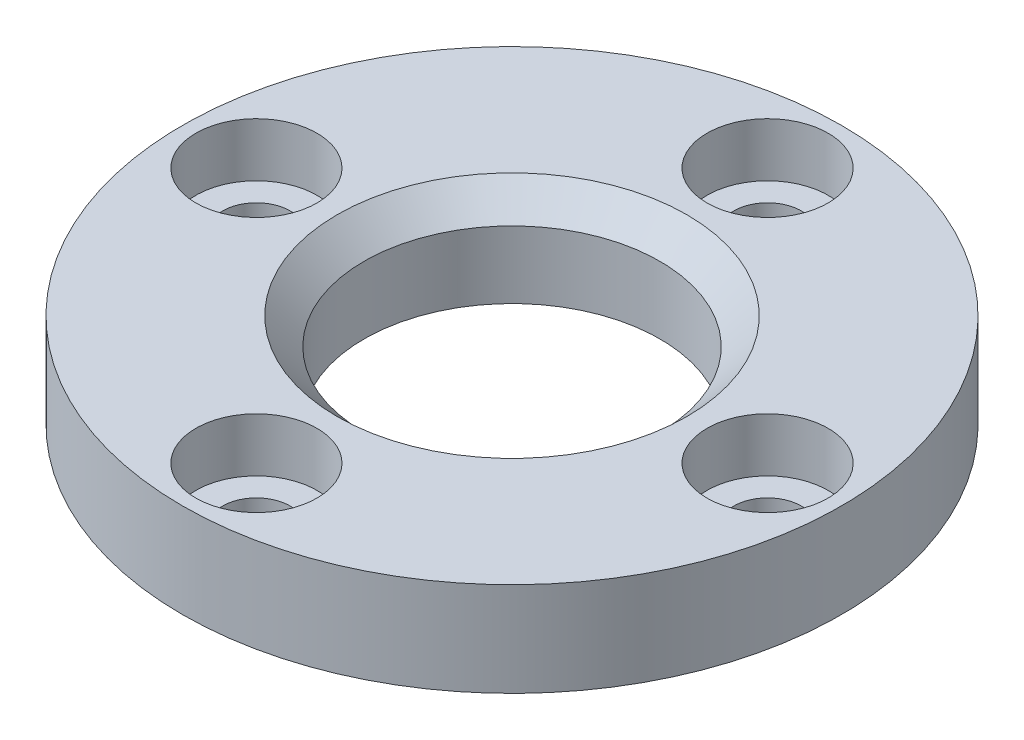
ISO-10303-21;
HEADER;
FILE_DESCRIPTION(('STEP AP214'),'2;1');
FILE_NAME('part.step','',(''),(''),'','','');
FILE_SCHEMA(('AUTOMOTIVE_DESIGN { 1 0 10303 214 1 1 1 1 }'));
ENDSEC;
DATA;
#1=APPLICATION_CONTEXT('core data for automotive mechanical design processes');
#2=APPLICATION_PROTOCOL_DEFINITION('international standard','automotive_design',2000,#1);
#3=PRODUCT_CONTEXT('',#1,'mechanical');
#4=PRODUCT('Part','Part','',(#3));
#5=PRODUCT_RELATED_PRODUCT_CATEGORY('part','',(#4));
#6=PRODUCT_DEFINITION_FORMATION('','',#4);
#7=PRODUCT_DEFINITION_CONTEXT('part definition',#1,'design');
#8=PRODUCT_DEFINITION('design','',#6,#7);
#9=PRODUCT_DEFINITION_SHAPE('','',#8);
#10=(LENGTH_UNIT() NAMED_UNIT(*) SI_UNIT(.MILLI.,.METRE.));
#11=(NAMED_UNIT(*) PLANE_ANGLE_UNIT() SI_UNIT($,.RADIAN.));
#12=(NAMED_UNIT(*) SI_UNIT($,.STERADIAN.) SOLID_ANGLE_UNIT());
#13=UNCERTAINTY_MEASURE_WITH_UNIT(LENGTH_MEASURE(1.E-05),#10,'distance_accuracy_value','');
#14=(GEOMETRIC_REPRESENTATION_CONTEXT(3) GLOBAL_UNCERTAINTY_ASSIGNED_CONTEXT((#13)) GLOBAL_UNIT_ASSIGNED_CONTEXT((#10,
#11,#12)) REPRESENTATION_CONTEXT('',''));
#15=CARTESIAN_POINT('',(0.,0.,0.));
#16=DIRECTION('',(0.,0.,1.));
#17=DIRECTION('',(1.,0.,0.));
#18=AXIS2_PLACEMENT_3D('',#15,#16,#17);
#19=CARTESIAN_POINT('',(0.,3.5,-9.5));
#20=DIRECTION('',(0.,-1.,0.));
#21=DIRECTION('',(0.,0.,-1.));
#22=AXIS2_PLACEMENT_3D('',#19,#20,#21);
#23=CYLINDRICAL_SURFACE('',#22,1.25);
#24=CARTESIAN_POINT('',(0.,0.,-9.5));
#25=DIRECTION('',(0.,1.,0.));
#26=DIRECTION('',(0.,0.,1.));
#27=AXIS2_PLACEMENT_3D('',#24,#25,#26);
#28=CIRCLE('',#27,1.25);
#29=CARTESIAN_POINT('',(0.,0.,-8.25));
#30=VERTEX_POINT('',#29);
#31=EDGE_CURVE('E86',#30,#30,#28,.T.);
#32=ORIENTED_EDGE('',*,*,#31,.F.);
#33=EDGE_LOOP('',(#32));
#34=FACE_BOUND('',#33,.T.);
#35=CARTESIAN_POINT('',(0.,1.5,-9.5));
#36=DIRECTION('',(0.,1.,0.));
#37=DIRECTION('',(0.,0.,1.));
#38=AXIS2_PLACEMENT_3D('',#35,#36,#37);
#39=CIRCLE('',#38,1.25);
#40=CARTESIAN_POINT('',(0.,1.5,-8.25));
#41=VERTEX_POINT('',#40);
#42=EDGE_CURVE('E61',#41,#41,#39,.T.);
#43=ORIENTED_EDGE('',*,*,#42,.T.);
#44=EDGE_LOOP('',(#43));
#45=FACE_BOUND('',#44,.T.);
#46=ADVANCED_FACE('F39',(#34,#45),#23,.F.);
#47=CARTESIAN_POINT('',(9.5,3.5,0.));
#48=DIRECTION('',(0.,-1.,0.));
#49=DIRECTION('',(0.,0.,-1.));
#50=AXIS2_PLACEMENT_3D('',#47,#48,#49);
#51=CYLINDRICAL_SURFACE('',#50,1.25000000000003);
#52=CARTESIAN_POINT('',(9.5,0.,0.));
#53=DIRECTION('',(0.,1.,0.));
#54=DIRECTION('',(0.,0.,1.));
#55=AXIS2_PLACEMENT_3D('',#52,#53,#54);
#56=CIRCLE('',#55,1.25000000000003);
#57=CARTESIAN_POINT('',(9.5,0.,1.25000000000003));
#58=VERTEX_POINT('',#57);
#59=EDGE_CURVE('E90',#58,#58,#56,.T.);
#60=ORIENTED_EDGE('',*,*,#59,.F.);
#61=EDGE_LOOP('',(#60));
#62=FACE_BOUND('',#61,.T.);
#63=CARTESIAN_POINT('',(9.5,1.5,0.));
#64=DIRECTION('',(0.,1.,0.));
#65=DIRECTION('',(0.,0.,1.));
#66=AXIS2_PLACEMENT_3D('',#63,#64,#65);
#67=CIRCLE('',#66,1.25000000000003);
#68=CARTESIAN_POINT('',(9.5,1.5,1.25000000000003));
#69=VERTEX_POINT('',#68);
#70=EDGE_CURVE('E66',#69,#69,#67,.T.);
#71=ORIENTED_EDGE('',*,*,#70,.T.);
#72=EDGE_LOOP('',(#71));
#73=FACE_BOUND('',#72,.T.);
#74=ADVANCED_FACE('F197',(#62,#73),#51,.F.);
#75=CARTESIAN_POINT('',(0.,3.5,9.5));
#76=DIRECTION('',(0.,-1.,0.));
#77=DIRECTION('',(0.,0.,-1.));
#78=AXIS2_PLACEMENT_3D('',#75,#76,#77);
#79=CYLINDRICAL_SURFACE('',#78,1.25000000000006);
#80=CARTESIAN_POINT('',(0.,0.,9.5));
#81=DIRECTION('',(0.,1.,0.));
#82=DIRECTION('',(0.,0.,1.));
#83=AXIS2_PLACEMENT_3D('',#80,#81,#82);
#84=CIRCLE('',#83,1.25000000000006);
#85=CARTESIAN_POINT('',(0.,0.,10.7500000000001));
#86=VERTEX_POINT('',#85);
#87=EDGE_CURVE('E94',#86,#86,#84,.T.);
#88=ORIENTED_EDGE('',*,*,#87,.F.);
#89=EDGE_LOOP('',(#88));
#90=FACE_BOUND('',#89,.T.);
#91=CARTESIAN_POINT('',(0.,1.5,9.5));
#92=DIRECTION('',(0.,1.,0.));
#93=DIRECTION('',(0.,0.,1.));
#94=AXIS2_PLACEMENT_3D('',#91,#92,#93);
#95=CIRCLE('',#94,1.25000000000006);
#96=CARTESIAN_POINT('',(0.,1.5,10.7500000000001));
#97=VERTEX_POINT('',#96);
#98=EDGE_CURVE('E70',#97,#97,#95,.T.);
#99=ORIENTED_EDGE('',*,*,#98,.T.);
#100=EDGE_LOOP('',(#99));
#101=FACE_BOUND('',#100,.T.);
#102=ADVANCED_FACE('F177',(#90,#101),#79,.F.);
#103=CARTESIAN_POINT('',(-9.5,3.5,0.));
#104=DIRECTION('',(0.,-1.,0.));
#105=DIRECTION('',(0.,0.,-1.));
#106=AXIS2_PLACEMENT_3D('',#103,#104,#105);
#107=CYLINDRICAL_SURFACE('',#106,1.2500000000001);
#108=CARTESIAN_POINT('',(-9.5,0.,0.));
#109=DIRECTION('',(0.,1.,0.));
#110=DIRECTION('',(0.,0.,1.));
#111=AXIS2_PLACEMENT_3D('',#108,#109,#110);
#112=CIRCLE('',#111,1.2500000000001);
#113=CARTESIAN_POINT('',(-9.5,0.,1.2500000000001));
#114=VERTEX_POINT('',#113);
#115=EDGE_CURVE('E65',#114,#114,#112,.T.);
#116=ORIENTED_EDGE('',*,*,#115,.F.);
#117=EDGE_LOOP('',(#116));
#118=FACE_BOUND('',#117,.T.);
#119=CARTESIAN_POINT('',(-9.5,1.5,0.));
#120=DIRECTION('',(0.,1.,0.));
#121=DIRECTION('',(0.,0.,1.));
#122=AXIS2_PLACEMENT_3D('',#119,#120,#121);
#123=CIRCLE('',#122,1.2500000000001);
#124=CARTESIAN_POINT('',(-9.5,1.5,1.2500000000001));
#125=VERTEX_POINT('',#124);
#126=EDGE_CURVE('E74',#125,#125,#123,.T.);
#127=ORIENTED_EDGE('',*,*,#126,.T.);
#128=EDGE_LOOP('',(#127));
#129=FACE_BOUND('',#128,.T.);
#130=ADVANCED_FACE('F146',(#118,#129),#107,.F.);
#131=CARTESIAN_POINT('',(0.,3.5,0.));
#132=DIRECTION('',(0.,1.,0.));
#133=DIRECTION('',(0.,0.,1.));
#134=AXIS2_PLACEMENT_3D('',#131,#132,#133);
#135=PLANE('',#134);
#136=CARTESIAN_POINT('',(0.,3.5,0.));
#137=DIRECTION('',(0.,1.,0.));
#138=DIRECTION('',(0.,0.,1.));
#139=AXIS2_PLACEMENT_3D('',#136,#137,#138);
#140=CIRCLE('',#139,6.5);
#141=CARTESIAN_POINT('',(0.,3.5,6.5));
#142=VERTEX_POINT('',#141);
#143=EDGE_CURVE('E10',#142,#142,#140,.F.);
#144=ORIENTED_EDGE('',*,*,#143,.T.);
#145=EDGE_LOOP('',(#144));
#146=FACE_BOUND('',#145,.T.);
#147=CARTESIAN_POINT('',(0.,3.5,-9.5));
#148=DIRECTION('',(0.,1.,0.));
#149=DIRECTION('',(0.,0.,1.));
#150=AXIS2_PLACEMENT_3D('',#147,#148,#149);
#151=CIRCLE('',#150,2.25);
#152=CARTESIAN_POINT('',(0.,3.5,-7.25));
#153=VERTEX_POINT('',#152);
#154=EDGE_CURVE('E125',#153,#153,#151,.T.);
#155=ORIENTED_EDGE('',*,*,#154,.F.);
#156=EDGE_LOOP('',(#155));
#157=FACE_BOUND('',#156,.T.);
#158=CARTESIAN_POINT('',(9.5,3.5,0.));
#159=DIRECTION('',(0.,1.,0.));
#160=DIRECTION('',(0.,0.,1.));
#161=AXIS2_PLACEMENT_3D('',#158,#159,#160);
#162=CIRCLE('',#161,2.25000000000003);
#163=CARTESIAN_POINT('',(9.5,3.5,2.25000000000003));
#164=VERTEX_POINT('',#163);
#165=EDGE_CURVE('E117',#164,#164,#162,.T.);
#166=ORIENTED_EDGE('',*,*,#165,.F.);
#167=EDGE_LOOP('',(#166));
#168=FACE_BOUND('',#167,.T.);
#169=CARTESIAN_POINT('',(0.,3.5,9.5));
#170=DIRECTION('',(0.,1.,0.));
#171=DIRECTION('',(0.,0.,1.));
#172=AXIS2_PLACEMENT_3D('',#169,#170,#171);
#173=CIRCLE('',#172,2.25000000000006);
#174=CARTESIAN_POINT('',(0.,3.5,11.7500000000001));
#175=VERTEX_POINT('',#174);
#176=EDGE_CURVE('E109',#175,#175,#173,.T.);
#177=ORIENTED_EDGE('',*,*,#176,.F.);
#178=EDGE_LOOP('',(#177));
#179=FACE_BOUND('',#178,.T.);
#180=CARTESIAN_POINT('',(-9.5,3.5,0.));
#181=DIRECTION('',(0.,1.,0.));
#182=DIRECTION('',(0.,0.,1.));
#183=AXIS2_PLACEMENT_3D('',#180,#181,#182);
#184=CIRCLE('',#183,2.2500000000001);
#185=CARTESIAN_POINT('',(-9.5,3.5,2.2500000000001));
#186=VERTEX_POINT('',#185);
#187=EDGE_CURVE('E101',#186,#186,#184,.T.);
#188=ORIENTED_EDGE('',*,*,#187,.F.);
#189=EDGE_LOOP('',(#188));
#190=FACE_BOUND('',#189,.T.);
#191=CARTESIAN_POINT('',(0.,3.5,0.));
#192=DIRECTION('',(0.,1.,0.));
#193=DIRECTION('',(0.,0.,1.));
#194=AXIS2_PLACEMENT_3D('',#191,#192,#193);
#195=CIRCLE('',#194,12.25);
#196=CARTESIAN_POINT('',(0.,3.5,12.25));
#197=VERTEX_POINT('',#196);
#198=EDGE_CURVE('E53',#197,#197,#195,.T.);
#199=ORIENTED_EDGE('',*,*,#198,.T.);
#200=EDGE_LOOP('',(#199));
#201=FACE_BOUND('',#200,.T.);
#202=ADVANCED_FACE('F142',(#146,#157,#168,#179,#190,#201),#135,.T.);
#203=CARTESIAN_POINT('',(0.,0.,0.));
#204=DIRECTION('',(0.,1.,0.));
#205=DIRECTION('',(0.,0.,1.));
#206=AXIS2_PLACEMENT_3D('',#203,#204,#205);
#207=PLANE('',#206);
#208=CARTESIAN_POINT('',(0.,0.,0.));
#209=DIRECTION('',(0.,1.,0.));
#210=DIRECTION('',(0.,0.,1.));
#211=AXIS2_PLACEMENT_3D('',#208,#209,#210);
#212=CIRCLE('',#211,12.25);
#213=CARTESIAN_POINT('',(0.,0.,12.25));
#214=VERTEX_POINT('',#213);
#215=EDGE_CURVE('E58',#214,#214,#212,.T.);
#216=ORIENTED_EDGE('',*,*,#215,.F.);
#217=EDGE_LOOP('',(#216));
#218=FACE_BOUND('',#217,.T.);
#219=CARTESIAN_POINT('',(0.,0.,0.));
#220=DIRECTION('',(0.,1.,0.));
#221=DIRECTION('',(0.,0.,1.));
#222=AXIS2_PLACEMENT_3D('',#219,#220,#221);
#223=CIRCLE('',#222,5.5);
#224=CARTESIAN_POINT('',(0.,0.,5.5));
#225=VERTEX_POINT('',#224);
#226=EDGE_CURVE('E81',#225,#225,#223,.T.);
#227=ORIENTED_EDGE('',*,*,#226,.T.);
#228=EDGE_LOOP('',(#227));
#229=FACE_BOUND('',#228,.T.);
#230=ORIENTED_EDGE('',*,*,#31,.T.);
#231=EDGE_LOOP('',(#230));
#232=FACE_BOUND('',#231,.T.);
#233=ORIENTED_EDGE('',*,*,#59,.T.);
#234=EDGE_LOOP('',(#233));
#235=FACE_BOUND('',#234,.T.);
#236=ORIENTED_EDGE('',*,*,#87,.T.);
#237=EDGE_LOOP('',(#236));
#238=FACE_BOUND('',#237,.T.);
#239=ORIENTED_EDGE('',*,*,#115,.T.);
#240=EDGE_LOOP('',(#239));
#241=FACE_BOUND('',#240,.T.);
#242=ADVANCED_FACE('F145',(#218,#229,#232,#235,#238,#241),#207,.F.);
#243=CARTESIAN_POINT('',(0.,3.5,0.));
#244=DIRECTION('',(0.,-1.,0.));
#245=DIRECTION('',(0.,0.,-1.));
#246=AXIS2_PLACEMENT_3D('',#243,#244,#245);
#247=CYLINDRICAL_SURFACE('',#246,12.25);
#248=ORIENTED_EDGE('',*,*,#198,.F.);
#249=EDGE_LOOP('',(#248));
#250=FACE_BOUND('',#249,.T.);
#251=ORIENTED_EDGE('',*,*,#215,.T.);
#252=EDGE_LOOP('',(#251));
#253=FACE_BOUND('',#252,.T.);
#254=ADVANCED_FACE('F156',(#250,#253),#247,.T.);
#255=CARTESIAN_POINT('',(0.,3.5,0.));
#256=DIRECTION('',(0.,-1.,0.));
#257=DIRECTION('',(0.,0.,-1.));
#258=AXIS2_PLACEMENT_3D('',#255,#256,#257);
#259=CYLINDRICAL_SURFACE('',#258,5.5);
#260=CARTESIAN_POINT('',(0.,2.5,0.));
#261=DIRECTION('',(0.,1.,0.));
#262=DIRECTION('',(0.,0.,1.));
#263=AXIS2_PLACEMENT_3D('',#260,#261,#262);
#264=CIRCLE('',#263,5.5);
#265=CARTESIAN_POINT('',(0.,2.5,5.5));
#266=VERTEX_POINT('',#265);
#267=EDGE_CURVE('E48',#266,#266,#264,.T.);
#268=ORIENTED_EDGE('',*,*,#267,.T.);
#269=EDGE_LOOP('',(#268));
#270=FACE_BOUND('',#269,.T.);
#271=ORIENTED_EDGE('',*,*,#226,.F.);
#272=EDGE_LOOP('',(#271));
#273=FACE_BOUND('',#272,.T.);
#274=ADVANCED_FACE('F159',(#270,#273),#259,.F.);
#275=CARTESIAN_POINT('',(-9.5,1.5,0.));
#276=DIRECTION('',(0.,1.,0.));
#277=DIRECTION('',(0.,0.,1.));
#278=AXIS2_PLACEMENT_3D('',#275,#276,#277);
#279=CYLINDRICAL_SURFACE('',#278,2.2500000000001);
#280=CARTESIAN_POINT('',(-9.5,1.5,0.));
#281=DIRECTION('',(0.,1.,0.));
#282=DIRECTION('',(0.,0.,1.));
#283=AXIS2_PLACEMENT_3D('',#280,#281,#282);
#284=CIRCLE('',#283,2.2500000000001);
#285=CARTESIAN_POINT('',(-9.5,1.5,2.2500000000001));
#286=VERTEX_POINT('',#285);
#287=EDGE_CURVE('E105',#286,#286,#284,.T.);
#288=ORIENTED_EDGE('',*,*,#287,.F.);
#289=EDGE_LOOP('',(#288));
#290=FACE_BOUND('',#289,.T.);
#291=ORIENTED_EDGE('',*,*,#187,.T.);
#292=EDGE_LOOP('',(#291));
#293=FACE_BOUND('',#292,.T.);
#294=ADVANCED_FACE('F185',(#290,#293),#279,.F.);
#295=CARTESIAN_POINT('',(-9.5,1.5,0.));
#296=DIRECTION('',(0.,1.,0.));
#297=DIRECTION('',(0.,0.,1.));
#298=AXIS2_PLACEMENT_3D('',#295,#296,#297);
#299=PLANE('',#298);
#300=ORIENTED_EDGE('',*,*,#126,.F.);
#301=EDGE_LOOP('',(#300));
#302=FACE_BOUND('',#301,.T.);
#303=ORIENTED_EDGE('',*,*,#287,.T.);
#304=EDGE_LOOP('',(#303));
#305=FACE_BOUND('',#304,.T.);
#306=ADVANCED_FACE('F181',(#302,#305),#299,.T.);
#307=CARTESIAN_POINT('',(0.,1.5,9.5));
#308=DIRECTION('',(0.,1.,0.));
#309=DIRECTION('',(0.,0.,1.));
#310=AXIS2_PLACEMENT_3D('',#307,#308,#309);
#311=CYLINDRICAL_SURFACE('',#310,2.25000000000006);
#312=CARTESIAN_POINT('',(0.,1.5,9.5));
#313=DIRECTION('',(0.,1.,0.));
#314=DIRECTION('',(0.,0.,1.));
#315=AXIS2_PLACEMENT_3D('',#312,#313,#314);
#316=CIRCLE('',#315,2.25000000000006);
#317=CARTESIAN_POINT('',(0.,1.5,11.7500000000001));
#318=VERTEX_POINT('',#317);
#319=EDGE_CURVE('E113',#318,#318,#316,.T.);
#320=ORIENTED_EDGE('',*,*,#319,.F.);
#321=EDGE_LOOP('',(#320));
#322=FACE_BOUND('',#321,.T.);
#323=ORIENTED_EDGE('',*,*,#176,.T.);
#324=EDGE_LOOP('',(#323));
#325=FACE_BOUND('',#324,.T.);
#326=ADVANCED_FACE('F184',(#322,#325),#311,.F.);
#327=CARTESIAN_POINT('',(0.,1.5,9.5));
#328=DIRECTION('',(0.,1.,0.));
#329=DIRECTION('',(0.,0.,1.));
#330=AXIS2_PLACEMENT_3D('',#327,#328,#329);
#331=PLANE('',#330);
#332=ORIENTED_EDGE('',*,*,#98,.F.);
#333=EDGE_LOOP('',(#332));
#334=FACE_BOUND('',#333,.T.);
#335=ORIENTED_EDGE('',*,*,#319,.T.);
#336=EDGE_LOOP('',(#335));
#337=FACE_BOUND('',#336,.T.);
#338=ADVANCED_FACE('F214',(#334,#337),#331,.T.);
#339=CARTESIAN_POINT('',(9.5,1.5,0.));
#340=DIRECTION('',(0.,1.,0.));
#341=DIRECTION('',(0.,0.,1.));
#342=AXIS2_PLACEMENT_3D('',#339,#340,#341);
#343=CYLINDRICAL_SURFACE('',#342,2.25000000000003);
#344=CARTESIAN_POINT('',(9.5,1.5,0.));
#345=DIRECTION('',(0.,1.,0.));
#346=DIRECTION('',(0.,0.,1.));
#347=AXIS2_PLACEMENT_3D('',#344,#345,#346);
#348=CIRCLE('',#347,2.25000000000003);
#349=CARTESIAN_POINT('',(9.5,1.5,2.25000000000003));
#350=VERTEX_POINT('',#349);
#351=EDGE_CURVE('E121',#350,#350,#348,.T.);
#352=ORIENTED_EDGE('',*,*,#351,.F.);
#353=EDGE_LOOP('',(#352));
#354=FACE_BOUND('',#353,.T.);
#355=ORIENTED_EDGE('',*,*,#165,.T.);
#356=EDGE_LOOP('',(#355));
#357=FACE_BOUND('',#356,.T.);
#358=ADVANCED_FACE('F217',(#354,#357),#343,.F.);
#359=CARTESIAN_POINT('',(9.5,1.5,0.));
#360=DIRECTION('',(0.,1.,0.));
#361=DIRECTION('',(0.,0.,1.));
#362=AXIS2_PLACEMENT_3D('',#359,#360,#361);
#363=PLANE('',#362);
#364=ORIENTED_EDGE('',*,*,#70,.F.);
#365=EDGE_LOOP('',(#364));
#366=FACE_BOUND('',#365,.T.);
#367=ORIENTED_EDGE('',*,*,#351,.T.);
#368=EDGE_LOOP('',(#367));
#369=FACE_BOUND('',#368,.T.);
#370=ADVANCED_FACE('F138',(#366,#369),#363,.T.);
#371=CARTESIAN_POINT('',(0.,1.5,-9.5));
#372=DIRECTION('',(0.,1.,0.));
#373=DIRECTION('',(0.,0.,1.));
#374=AXIS2_PLACEMENT_3D('',#371,#372,#373);
#375=CYLINDRICAL_SURFACE('',#374,2.25);
#376=CARTESIAN_POINT('',(0.,1.5,-9.5));
#377=DIRECTION('',(0.,1.,0.));
#378=DIRECTION('',(0.,0.,1.));
#379=AXIS2_PLACEMENT_3D('',#376,#377,#378);
#380=CIRCLE('',#379,2.25);
#381=CARTESIAN_POINT('',(0.,1.5,-7.25));
#382=VERTEX_POINT('',#381);
#383=EDGE_CURVE('E78',#382,#382,#380,.T.);
#384=ORIENTED_EDGE('',*,*,#383,.F.);
#385=EDGE_LOOP('',(#384));
#386=FACE_BOUND('',#385,.T.);
#387=ORIENTED_EDGE('',*,*,#154,.T.);
#388=EDGE_LOOP('',(#387));
#389=FACE_BOUND('',#388,.T.);
#390=ADVANCED_FACE('F135',(#386,#389),#375,.F.);
#391=CARTESIAN_POINT('',(0.,1.5,-9.5));
#392=DIRECTION('',(0.,1.,0.));
#393=DIRECTION('',(0.,0.,1.));
#394=AXIS2_PLACEMENT_3D('',#391,#392,#393);
#395=PLANE('',#394);
#396=ORIENTED_EDGE('',*,*,#42,.F.);
#397=EDGE_LOOP('',(#396));
#398=FACE_BOUND('',#397,.T.);
#399=ORIENTED_EDGE('',*,*,#383,.T.);
#400=EDGE_LOOP('',(#399));
#401=FACE_BOUND('',#400,.T.);
#402=ADVANCED_FACE('F133',(#398,#401),#395,.T.);
#403=CARTESIAN_POINT('',(0.,2.5,0.));
#404=DIRECTION('',(0.,1.,0.));
#405=DIRECTION('',(0.,0.,1.));
#406=AXIS2_PLACEMENT_3D('',#403,#404,#405);
#407=CONICAL_SURFACE('',#406,5.5,0.785398163397451);
#408=ORIENTED_EDGE('',*,*,#143,.F.);
#409=EDGE_LOOP('',(#408));
#410=FACE_BOUND('',#409,.T.);
#411=ORIENTED_EDGE('',*,*,#267,.F.);
#412=EDGE_LOOP('',(#411));
#413=FACE_BOUND('',#412,.T.);
#414=ADVANCED_FACE('F42',(#410,#413),#407,.F.);
#415=CLOSED_SHELL('',(#46,#74,#102,#130,#202,#242,#254,#274,#294,#306,#326,#338,#358,#370,#390,
#402,#414));
#416=MANIFOLD_SOLID_BREP('B2',#415);
#417=ADVANCED_BREP_SHAPE_REPRESENTATION('',(#18,#416),#14);
#418=SHAPE_DEFINITION_REPRESENTATION(#9,#417);
ENDSEC;
END-ISO-10303-21;
